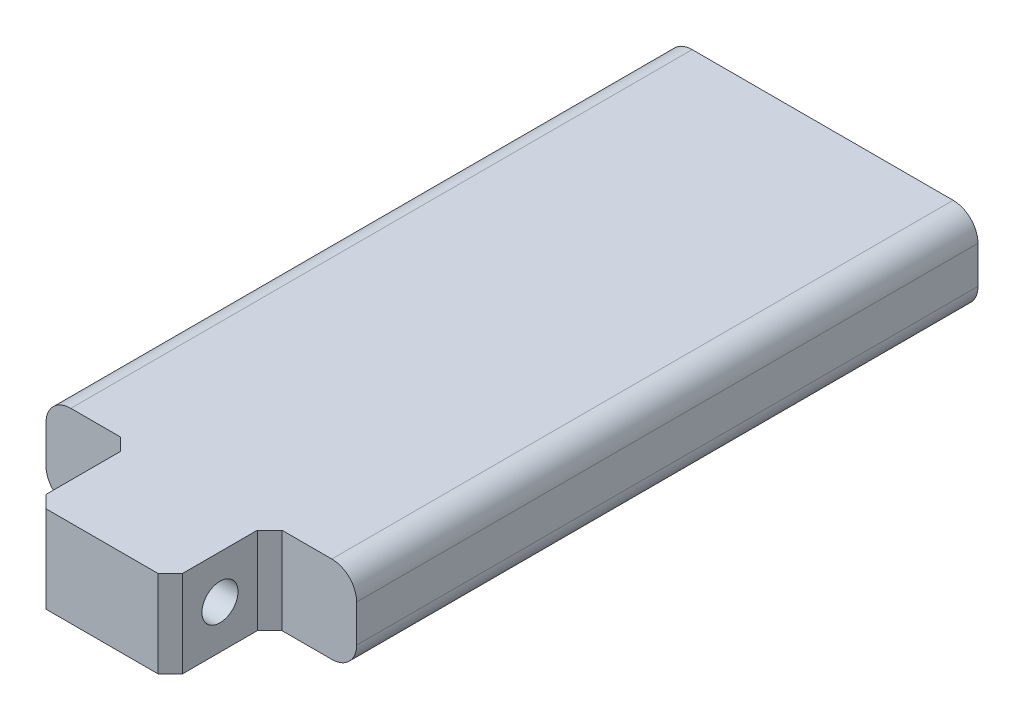
ISO-10303-21;
HEADER;
FILE_DESCRIPTION(('STEP AP214'),'2;1');
FILE_NAME('part.step','',(''),(''),'','','');
FILE_SCHEMA(('AUTOMOTIVE_DESIGN { 1 0 10303 214 1 1 1 1 }'));
ENDSEC;
DATA;
#1=APPLICATION_CONTEXT('core data for automotive mechanical design processes');
#2=APPLICATION_PROTOCOL_DEFINITION('international standard','automotive_design',2000,#1);
#3=PRODUCT_CONTEXT('',#1,'mechanical');
#4=PRODUCT('Part','Part','',(#3));
#5=PRODUCT_RELATED_PRODUCT_CATEGORY('part','',(#4));
#6=PRODUCT_DEFINITION_FORMATION('','',#4);
#7=PRODUCT_DEFINITION_CONTEXT('part definition',#1,'design');
#8=PRODUCT_DEFINITION('design','',#6,#7);
#9=PRODUCT_DEFINITION_SHAPE('','',#8);
#10=(LENGTH_UNIT() NAMED_UNIT(*) SI_UNIT(.MILLI.,.METRE.));
#11=(NAMED_UNIT(*) PLANE_ANGLE_UNIT() SI_UNIT($,.RADIAN.));
#12=(NAMED_UNIT(*) SI_UNIT($,.STERADIAN.) SOLID_ANGLE_UNIT());
#13=UNCERTAINTY_MEASURE_WITH_UNIT(LENGTH_MEASURE(1.E-05),#10,'distance_accuracy_value','');
#14=(GEOMETRIC_REPRESENTATION_CONTEXT(3) GLOBAL_UNCERTAINTY_ASSIGNED_CONTEXT((#13)) GLOBAL_UNIT_ASSIGNED_CONTEXT((#10,
#11,#12)) REPRESENTATION_CONTEXT('',''));
#15=CARTESIAN_POINT('',(0.,0.,0.));
#16=DIRECTION('',(0.,0.,1.));
#17=DIRECTION('',(1.,0.,0.));
#18=AXIS2_PLACEMENT_3D('',#15,#16,#17);
#19=CARTESIAN_POINT('',(12.5,-3.5,58.));
#20=DIRECTION('',(-1.,0.,0.));
#21=DIRECTION('',(0.,0.,1.));
#22=AXIS2_PLACEMENT_3D('',#19,#20,#21);
#23=PLANE('',#22);
#24=DIRECTION('',(0.,1.,0.));
#25=VECTOR('',#24,1.);
#26=CARTESIAN_POINT('',(12.5,-3.5,0.));
#27=LINE('',#26,#25);
#28=CARTESIAN_POINT('',(12.5,-1.5,0.));
#29=VERTEX_POINT('',#28);
#30=CARTESIAN_POINT('',(12.5,1.5,0.));
#31=VERTEX_POINT('',#30);
#32=EDGE_CURVE('E201',#29,#31,#27,.T.);
#33=ORIENTED_EDGE('',*,*,#32,.T.);
#34=DIRECTION('',(0.,0.,-1.));
#35=VECTOR('',#34,1.);
#36=CARTESIAN_POINT('',(12.5,1.5,58.));
#37=LINE('',#36,#35);
#38=CARTESIAN_POINT('',(12.5,1.5,50.));
#39=VERTEX_POINT('',#38);
#40=EDGE_CURVE('E256',#31,#39,#37,.F.);
#41=ORIENTED_EDGE('',*,*,#40,.T.);
#42=DIRECTION('',(0.,1.,0.));
#43=VECTOR('',#42,1.);
#44=CARTESIAN_POINT('',(12.5,-3.5,50.));
#45=LINE('',#44,#43);
#46=CARTESIAN_POINT('',(12.5,-1.5,50.));
#47=VERTEX_POINT('',#46);
#48=EDGE_CURVE('E184',#47,#39,#45,.T.);
#49=ORIENTED_EDGE('',*,*,#48,.F.);
#50=DIRECTION('',(0.,0.,-1.));
#51=VECTOR('',#50,1.);
#52=CARTESIAN_POINT('',(12.5,-1.5,58.));
#53=LINE('',#52,#51);
#54=EDGE_CURVE('E253',#47,#29,#53,.T.);
#55=ORIENTED_EDGE('',*,*,#54,.T.);
#56=EDGE_LOOP('',(#33,#41,#49,#55));
#57=FACE_BOUND('',#56,.T.);
#58=ADVANCED_FACE('F37',(#57),#23,.F.);
#59=CARTESIAN_POINT('',(-12.5,3.5,58.));
#60=DIRECTION('',(0.,-1.,0.));
#61=DIRECTION('',(0.,0.,-1.));
#62=AXIS2_PLACEMENT_3D('',#59,#60,#61);
#63=PLANE('',#62);
#64=DIRECTION('',(-1.,0.,0.));
#65=VECTOR('',#64,1.);
#66=CARTESIAN_POINT('',(12.5,3.5,50.));
#67=LINE('',#66,#65);
#68=CARTESIAN_POINT('',(10.5,3.5,50.));
#69=VERTEX_POINT('',#68);
#70=CARTESIAN_POINT('',(6.5,3.5,50.));
#71=VERTEX_POINT('',#70);
#72=EDGE_CURVE('E177',#69,#71,#67,.T.);
#73=ORIENTED_EDGE('',*,*,#72,.F.);
#74=DIRECTION('',(0.,0.,-1.));
#75=VECTOR('',#74,1.);
#76=CARTESIAN_POINT('',(10.5,3.5,58.));
#77=LINE('',#76,#75);
#78=CARTESIAN_POINT('',(10.5,3.5,0.));
#79=VERTEX_POINT('',#78);
#80=EDGE_CURVE('E242',#69,#79,#77,.T.);
#81=ORIENTED_EDGE('',*,*,#80,.T.);
#82=DIRECTION('',(-1.,0.,0.));
#83=VECTOR('',#82,1.);
#84=CARTESIAN_POINT('',(-12.5,3.5,0.));
#85=LINE('',#84,#83);
#86=CARTESIAN_POINT('',(-10.5,3.5,0.));
#87=VERTEX_POINT('',#86);
#88=EDGE_CURVE('E212',#79,#87,#85,.T.);
#89=ORIENTED_EDGE('',*,*,#88,.T.);
#90=DIRECTION('',(0.,0.,-1.));
#91=VECTOR('',#90,1.);
#92=CARTESIAN_POINT('',(-10.5,3.5,58.));
#93=LINE('',#92,#91);
#94=CARTESIAN_POINT('',(-10.5,3.5,50.));
#95=VERTEX_POINT('',#94);
#96=EDGE_CURVE('E239',#87,#95,#93,.F.);
#97=ORIENTED_EDGE('',*,*,#96,.T.);
#98=DIRECTION('',(-1.,0.,0.));
#99=VECTOR('',#98,1.);
#100=CARTESIAN_POINT('',(-12.5,3.5,50.));
#101=LINE('',#100,#99);
#102=CARTESIAN_POINT('',(-6.50000000000001,3.5,50.));
#103=VERTEX_POINT('',#102);
#104=EDGE_CURVE('E194',#103,#95,#101,.T.);
#105=ORIENTED_EDGE('',*,*,#104,.F.);
#106=DIRECTION('',(-0.707106781186547,0.,-0.707106781186547));
#107=VECTOR('',#106,1.);
#108=CARTESIAN_POINT('',(-5.5,3.5,51.));
#109=LINE('',#108,#107);
#110=CARTESIAN_POINT('',(-5.5,3.5,51.));
#111=VERTEX_POINT('',#110);
#112=EDGE_CURVE('E45',#103,#111,#109,.F.);
#113=ORIENTED_EDGE('',*,*,#112,.T.);
#114=DIRECTION('',(0.,0.,-1.));
#115=VECTOR('',#114,1.);
#116=CARTESIAN_POINT('',(-5.5,3.5,58.));
#117=LINE('',#116,#115);
#118=CARTESIAN_POINT('',(-5.5,3.5,57.));
#119=VERTEX_POINT('',#118);
#120=EDGE_CURVE('E190',#119,#111,#117,.T.);
#121=ORIENTED_EDGE('',*,*,#120,.F.);
#122=DIRECTION('',(-0.707106781186553,0.,-0.707106781186543));
#123=VECTOR('',#122,1.);
#124=CARTESIAN_POINT('',(-5.5,3.5,57.));
#125=LINE('',#124,#123);
#126=CARTESIAN_POINT('',(-4.49999999999999,3.5,58.));
#127=VERTEX_POINT('',#126);
#128=EDGE_CURVE('E224',#119,#127,#125,.F.);
#129=ORIENTED_EDGE('',*,*,#128,.T.);
#130=DIRECTION('',(-1.,0.,0.));
#131=VECTOR('',#130,1.);
#132=CARTESIAN_POINT('',(-12.5,3.5,58.));
#133=LINE('',#132,#131);
#134=CARTESIAN_POINT('',(4.50000000000001,3.5,58.));
#135=VERTEX_POINT('',#134);
#136=EDGE_CURVE('E202',#135,#127,#133,.T.);
#137=ORIENTED_EDGE('',*,*,#136,.F.);
#138=DIRECTION('',(-0.707106781186545,0.,0.70710678118655));
#139=VECTOR('',#138,1.);
#140=CARTESIAN_POINT('',(4.50000000000001,3.5,58.));
#141=LINE('',#140,#139);
#142=CARTESIAN_POINT('',(5.5,3.5,57.));
#143=VERTEX_POINT('',#142);
#144=EDGE_CURVE('E226',#135,#143,#141,.F.);
#145=ORIENTED_EDGE('',*,*,#144,.T.);
#146=DIRECTION('',(0.,0.,1.));
#147=VECTOR('',#146,1.);
#148=CARTESIAN_POINT('',(5.5,3.5,58.));
#149=LINE('',#148,#147);
#150=CARTESIAN_POINT('',(5.5,3.5,51.));
#151=VERTEX_POINT('',#150);
#152=EDGE_CURVE('E182',#151,#143,#149,.T.);
#153=ORIENTED_EDGE('',*,*,#152,.F.);
#154=DIRECTION('',(-0.707106781186543,0.,0.707106781186553));
#155=VECTOR('',#154,1.);
#156=CARTESIAN_POINT('',(-6.99999999999986,3.5,63.5000000000001));
#157=LINE('',#156,#155);
#158=EDGE_CURVE('E286',#151,#71,#157,.F.);
#159=ORIENTED_EDGE('',*,*,#158,.T.);
#160=EDGE_LOOP('',(#73,#81,#89,#97,#105,#113,#121,#129,#137,#145,#153,#159));
#161=FACE_BOUND('',#160,.T.);
#162=ADVANCED_FACE('F304',(#161),#63,.F.);
#163=CARTESIAN_POINT('',(-12.5,-3.5,58.));
#164=DIRECTION('',(1.,0.,0.));
#165=DIRECTION('',(0.,0.,-1.));
#166=AXIS2_PLACEMENT_3D('',#163,#164,#165);
#167=PLANE('',#166);
#168=DIRECTION('',(0.,1.,0.));
#169=VECTOR('',#168,1.);
#170=CARTESIAN_POINT('',(-12.5,-3.5,50.));
#171=LINE('',#170,#169);
#172=CARTESIAN_POINT('',(-12.5,-1.5,50.));
#173=VERTEX_POINT('',#172);
#174=CARTESIAN_POINT('',(-12.5,1.5,50.));
#175=VERTEX_POINT('',#174);
#176=EDGE_CURVE('E196',#173,#175,#171,.T.);
#177=ORIENTED_EDGE('',*,*,#176,.T.);
#178=DIRECTION('',(0.,0.,-1.));
#179=VECTOR('',#178,1.);
#180=CARTESIAN_POINT('',(-12.5,1.5,58.));
#181=LINE('',#180,#179);
#182=CARTESIAN_POINT('',(-12.5,1.5,0.));
#183=VERTEX_POINT('',#182);
#184=EDGE_CURVE('E269',#175,#183,#181,.T.);
#185=ORIENTED_EDGE('',*,*,#184,.T.);
#186=DIRECTION('',(0.,-1.,0.));
#187=VECTOR('',#186,1.);
#188=CARTESIAN_POINT('',(-12.5,-3.5,0.));
#189=LINE('',#188,#187);
#190=CARTESIAN_POINT('',(-12.5,-1.5,0.));
#191=VERTEX_POINT('',#190);
#192=EDGE_CURVE('E215',#183,#191,#189,.T.);
#193=ORIENTED_EDGE('',*,*,#192,.T.);
#194=DIRECTION('',(0.,0.,-1.));
#195=VECTOR('',#194,1.);
#196=CARTESIAN_POINT('',(-12.5,-1.5,58.));
#197=LINE('',#196,#195);
#198=EDGE_CURVE('E267',#191,#173,#197,.F.);
#199=ORIENTED_EDGE('',*,*,#198,.T.);
#200=EDGE_LOOP('',(#177,#185,#193,#199));
#201=FACE_BOUND('',#200,.T.);
#202=ADVANCED_FACE('F324',(#201),#167,.F.);
#203=CARTESIAN_POINT('',(-12.5,-3.5,58.));
#204=DIRECTION('',(0.,1.,0.));
#205=DIRECTION('',(0.,0.,1.));
#206=AXIS2_PLACEMENT_3D('',#203,#204,#205);
#207=PLANE('',#206);
#208=DIRECTION('',(1.,0.,0.));
#209=VECTOR('',#208,1.);
#210=CARTESIAN_POINT('',(-12.5,-3.5,0.));
#211=LINE('',#210,#209);
#212=CARTESIAN_POINT('',(-10.5,-3.5,0.));
#213=VERTEX_POINT('',#212);
#214=CARTESIAN_POINT('',(10.5,-3.5,0.));
#215=VERTEX_POINT('',#214);
#216=EDGE_CURVE('E206',#213,#215,#211,.T.);
#217=ORIENTED_EDGE('',*,*,#216,.T.);
#218=DIRECTION('',(0.,0.,-1.));
#219=VECTOR('',#218,1.);
#220=CARTESIAN_POINT('',(10.5,-3.5,58.));
#221=LINE('',#220,#219);
#222=CARTESIAN_POINT('',(10.5,-3.5,50.));
#223=VERTEX_POINT('',#222);
#224=EDGE_CURVE('E265',#215,#223,#221,.F.);
#225=ORIENTED_EDGE('',*,*,#224,.T.);
#226=DIRECTION('',(-1.,0.,0.));
#227=VECTOR('',#226,1.);
#228=CARTESIAN_POINT('',(12.5,-3.5,50.));
#229=LINE('',#228,#227);
#230=CARTESIAN_POINT('',(6.5,-3.5,50.));
#231=VERTEX_POINT('',#230);
#232=EDGE_CURVE('E178',#223,#231,#229,.T.);
#233=ORIENTED_EDGE('',*,*,#232,.T.);
#234=DIRECTION('',(0.707106781186543,0.,-0.707106781186553));
#235=VECTOR('',#234,1.);
#236=CARTESIAN_POINT('',(-6.99999999999986,-3.5,63.5000000000001));
#237=LINE('',#236,#235);
#238=CARTESIAN_POINT('',(5.5,-3.5,51.));
#239=VERTEX_POINT('',#238);
#240=EDGE_CURVE('E288',#231,#239,#237,.F.);
#241=ORIENTED_EDGE('',*,*,#240,.T.);
#242=DIRECTION('',(0.,0.,1.));
#243=VECTOR('',#242,1.);
#244=CARTESIAN_POINT('',(5.5,-3.5,58.));
#245=LINE('',#244,#243);
#246=CARTESIAN_POINT('',(5.5,-3.5,57.));
#247=VERTEX_POINT('',#246);
#248=EDGE_CURVE('E181',#239,#247,#245,.T.);
#249=ORIENTED_EDGE('',*,*,#248,.T.);
#250=DIRECTION('',(0.707106781186545,0.,-0.70710678118655));
#251=VECTOR('',#250,1.);
#252=CARTESIAN_POINT('',(4.50000000000001,-3.5,58.));
#253=LINE('',#252,#251);
#254=CARTESIAN_POINT('',(4.50000000000001,-3.5,58.));
#255=VERTEX_POINT('',#254);
#256=EDGE_CURVE('E234',#247,#255,#253,.F.);
#257=ORIENTED_EDGE('',*,*,#256,.T.);
#258=DIRECTION('',(1.,0.,0.));
#259=VECTOR('',#258,1.);
#260=CARTESIAN_POINT('',(-12.5,-3.5,58.));
#261=LINE('',#260,#259);
#262=CARTESIAN_POINT('',(-4.49999999999999,-3.5,58.));
#263=VERTEX_POINT('',#262);
#264=EDGE_CURVE('E205',#263,#255,#261,.T.);
#265=ORIENTED_EDGE('',*,*,#264,.F.);
#266=DIRECTION('',(0.707106781186553,0.,0.707106781186543));
#267=VECTOR('',#266,1.);
#268=CARTESIAN_POINT('',(-5.5,-3.5,57.));
#269=LINE('',#268,#267);
#270=CARTESIAN_POINT('',(-5.5,-3.5,57.));
#271=VERTEX_POINT('',#270);
#272=EDGE_CURVE('E232',#263,#271,#269,.F.);
#273=ORIENTED_EDGE('',*,*,#272,.T.);
#274=DIRECTION('',(0.,0.,-1.));
#275=VECTOR('',#274,1.);
#276=CARTESIAN_POINT('',(-5.5,-3.5,58.));
#277=LINE('',#276,#275);
#278=CARTESIAN_POINT('',(-5.5,-3.5,51.));
#279=VERTEX_POINT('',#278);
#280=EDGE_CURVE('E191',#271,#279,#277,.T.);
#281=ORIENTED_EDGE('',*,*,#280,.T.);
#282=DIRECTION('',(0.707106781186547,0.,0.707106781186547));
#283=VECTOR('',#282,1.);
#284=CARTESIAN_POINT('',(-5.5,-3.5,51.));
#285=LINE('',#284,#283);
#286=CARTESIAN_POINT('',(-6.50000000000001,-3.5,50.));
#287=VERTEX_POINT('',#286);
#288=EDGE_CURVE('E11',#279,#287,#285,.F.);
#289=ORIENTED_EDGE('',*,*,#288,.T.);
#290=DIRECTION('',(-1.,0.,0.));
#291=VECTOR('',#290,1.);
#292=CARTESIAN_POINT('',(-12.5,-3.5,50.));
#293=LINE('',#292,#291);
#294=CARTESIAN_POINT('',(-10.5,-3.5,50.));
#295=VERTEX_POINT('',#294);
#296=EDGE_CURVE('E193',#287,#295,#293,.T.);
#297=ORIENTED_EDGE('',*,*,#296,.T.);
#298=DIRECTION('',(0.,0.,-1.));
#299=VECTOR('',#298,1.);
#300=CARTESIAN_POINT('',(-10.5,-3.5,58.));
#301=LINE('',#300,#299);
#302=EDGE_CURVE('E262',#295,#213,#301,.T.);
#303=ORIENTED_EDGE('',*,*,#302,.T.);
#304=EDGE_LOOP('',(#217,#225,#233,#241,#249,#257,#265,#273,#281,#289,#297,#303));
#305=FACE_BOUND('',#304,.T.);
#306=ADVANCED_FACE('F292',(#305),#207,.F.);
#307=CARTESIAN_POINT('',(0.,0.,58.));
#308=DIRECTION('',(0.,0.,-1.));
#309=DIRECTION('',(-1.,0.,0.));
#310=AXIS2_PLACEMENT_3D('',#307,#308,#309);
#311=PLANE('',#310);
#312=ORIENTED_EDGE('',*,*,#264,.T.);
#313=DIRECTION('',(0.,1.,0.));
#314=VECTOR('',#313,1.);
#315=CARTESIAN_POINT('',(4.50000000000001,0.,58.));
#316=LINE('',#315,#314);
#317=EDGE_CURVE('E221',#255,#135,#316,.T.);
#318=ORIENTED_EDGE('',*,*,#317,.T.);
#319=ORIENTED_EDGE('',*,*,#136,.T.);
#320=DIRECTION('',(0.,-1.,0.));
#321=VECTOR('',#320,1.);
#322=CARTESIAN_POINT('',(-4.49999999999999,0.,58.));
#323=LINE('',#322,#321);
#324=EDGE_CURVE('E209',#127,#263,#323,.T.);
#325=ORIENTED_EDGE('',*,*,#324,.T.);
#326=EDGE_LOOP('',(#312,#318,#319,#325));
#327=FACE_BOUND('',#326,.T.);
#328=ADVANCED_FACE('F382',(#327),#311,.F.);
#329=CARTESIAN_POINT('',(0.,0.,0.));
#330=DIRECTION('',(0.,0.,-1.));
#331=DIRECTION('',(-1.,0.,0.));
#332=AXIS2_PLACEMENT_3D('',#329,#330,#331);
#333=PLANE('',#332);
#334=CARTESIAN_POINT('',(7.,0.,0.));
#335=DIRECTION('',(0.,0.,-1.));
#336=DIRECTION('',(-1.,0.,0.));
#337=AXIS2_PLACEMENT_3D('',#334,#335,#336);
#338=CIRCLE('',#337,1.24999999999999);
#339=CARTESIAN_POINT('',(5.75000000000001,0.,0.));
#340=VERTEX_POINT('',#339);
#341=EDGE_CURVE('E165',#340,#340,#338,.T.);
#342=ORIENTED_EDGE('',*,*,#341,.F.);
#343=EDGE_LOOP('',(#342));
#344=FACE_BOUND('',#343,.T.);
#345=CARTESIAN_POINT('',(-7.,0.,0.));
#346=DIRECTION('',(0.,0.,-1.));
#347=DIRECTION('',(-1.,0.,0.));
#348=AXIS2_PLACEMENT_3D('',#345,#346,#347);
#349=CIRCLE('',#348,1.24999999999999);
#350=CARTESIAN_POINT('',(-8.24999999999999,0.,0.));
#351=VERTEX_POINT('',#350);
#352=EDGE_CURVE('E164',#351,#351,#349,.T.);
#353=ORIENTED_EDGE('',*,*,#352,.F.);
#354=EDGE_LOOP('',(#353));
#355=FACE_BOUND('',#354,.T.);
#356=ORIENTED_EDGE('',*,*,#88,.F.);
#357=CARTESIAN_POINT('',(10.5,1.5,0.));
#358=DIRECTION('',(0.,0.,-1.));
#359=DIRECTION('',(-1.,0.,0.));
#360=AXIS2_PLACEMENT_3D('',#357,#358,#359);
#361=CIRCLE('',#360,2.);
#362=EDGE_CURVE('E251',#79,#31,#361,.T.);
#363=ORIENTED_EDGE('',*,*,#362,.T.);
#364=ORIENTED_EDGE('',*,*,#32,.F.);
#365=CARTESIAN_POINT('',(10.5,-1.5,0.));
#366=DIRECTION('',(0.,0.,-1.));
#367=DIRECTION('',(-1.,0.,0.));
#368=AXIS2_PLACEMENT_3D('',#365,#366,#367);
#369=CIRCLE('',#368,2.);
#370=EDGE_CURVE('E249',#29,#215,#369,.T.);
#371=ORIENTED_EDGE('',*,*,#370,.T.);
#372=ORIENTED_EDGE('',*,*,#216,.F.);
#373=CARTESIAN_POINT('',(-10.5,-1.5,0.));
#374=DIRECTION('',(0.,0.,-1.));
#375=DIRECTION('',(-1.,0.,0.));
#376=AXIS2_PLACEMENT_3D('',#373,#374,#375);
#377=CIRCLE('',#376,2.);
#378=EDGE_CURVE('E245',#213,#191,#377,.T.);
#379=ORIENTED_EDGE('',*,*,#378,.T.);
#380=ORIENTED_EDGE('',*,*,#192,.F.);
#381=CARTESIAN_POINT('',(-10.5,1.5,0.));
#382=DIRECTION('',(0.,0.,-1.));
#383=DIRECTION('',(-1.,0.,0.));
#384=AXIS2_PLACEMENT_3D('',#381,#382,#383);
#385=CIRCLE('',#384,2.);
#386=EDGE_CURVE('E247',#183,#87,#385,.T.);
#387=ORIENTED_EDGE('',*,*,#386,.T.);
#388=EDGE_LOOP('',(#356,#363,#364,#371,#372,#379,#380,#387));
#389=FACE_BOUND('',#388,.T.);
#390=ADVANCED_FACE('F316',(#344,#355,#389),#333,.T.);
#391=CARTESIAN_POINT('',(-12.5,-3.5,50.));
#392=DIRECTION('',(0.,0.,-1.));
#393=DIRECTION('',(-1.,0.,0.));
#394=AXIS2_PLACEMENT_3D('',#391,#392,#393);
#395=PLANE('',#394);
#396=ORIENTED_EDGE('',*,*,#296,.F.);
#397=DIRECTION('',(0.,1.,0.));
#398=VECTOR('',#397,1.);
#399=CARTESIAN_POINT('',(-6.50000000000001,3.5,50.));
#400=LINE('',#399,#398);
#401=EDGE_CURVE('E282',#287,#103,#400,.T.);
#402=ORIENTED_EDGE('',*,*,#401,.T.);
#403=ORIENTED_EDGE('',*,*,#104,.T.);
#404=CARTESIAN_POINT('',(-10.5,1.5,50.));
#405=DIRECTION('',(0.,0.,-1.));
#406=DIRECTION('',(-1.,0.,0.));
#407=AXIS2_PLACEMENT_3D('',#404,#405,#406);
#408=CIRCLE('',#407,2.);
#409=EDGE_CURVE('E275',#95,#175,#408,.F.);
#410=ORIENTED_EDGE('',*,*,#409,.T.);
#411=ORIENTED_EDGE('',*,*,#176,.F.);
#412=CARTESIAN_POINT('',(-10.5,-1.5,50.));
#413=DIRECTION('',(0.,0.,-1.));
#414=DIRECTION('',(-1.,0.,0.));
#415=AXIS2_PLACEMENT_3D('',#412,#413,#414);
#416=CIRCLE('',#415,2.);
#417=EDGE_CURVE('E272',#173,#295,#416,.F.);
#418=ORIENTED_EDGE('',*,*,#417,.T.);
#419=EDGE_LOOP('',(#396,#402,#403,#410,#411,#418));
#420=FACE_BOUND('',#419,.T.);
#421=ADVANCED_FACE('F330',(#420),#395,.F.);
#422=CARTESIAN_POINT('',(-5.5,-3.5,58.));
#423=DIRECTION('',(1.,0.,0.));
#424=DIRECTION('',(0.,0.,-1.));
#425=AXIS2_PLACEMENT_3D('',#422,#423,#424);
#426=PLANE('',#425);
#427=CARTESIAN_POINT('',(-5.50000000000037,0.,53.9999999999999));
#428=DIRECTION('',(-1.,0.,0.));
#429=DIRECTION('',(0.,0.,1.));
#430=AXIS2_PLACEMENT_3D('',#427,#428,#429);
#431=CIRCLE('',#430,1.45);
#432=CARTESIAN_POINT('',(-5.50000000000037,0.,55.4499999999999));
#433=VERTEX_POINT('',#432);
#434=EDGE_CURVE('E563',#433,#433,#431,.T.);
#435=ORIENTED_EDGE('',*,*,#434,.F.);
#436=EDGE_LOOP('',(#435));
#437=FACE_BOUND('',#436,.T.);
#438=ORIENTED_EDGE('',*,*,#120,.T.);
#439=DIRECTION('',(0.,-1.,0.));
#440=VECTOR('',#439,1.);
#441=CARTESIAN_POINT('',(-5.5,-3.5,51.));
#442=LINE('',#441,#440);
#443=EDGE_CURVE('E58',#111,#279,#442,.T.);
#444=ORIENTED_EDGE('',*,*,#443,.T.);
#445=ORIENTED_EDGE('',*,*,#280,.F.);
#446=DIRECTION('',(0.,1.,0.));
#447=VECTOR('',#446,1.);
#448=CARTESIAN_POINT('',(-5.5,-3.5,57.));
#449=LINE('',#448,#447);
#450=EDGE_CURVE('E236',#271,#119,#449,.T.);
#451=ORIENTED_EDGE('',*,*,#450,.T.);
#452=EDGE_LOOP('',(#438,#444,#445,#451));
#453=FACE_BOUND('',#452,.T.);
#454=ADVANCED_FACE('F378',(#437,#453),#426,.F.);
#455=CARTESIAN_POINT('',(5.5,-3.5,58.));
#456=DIRECTION('',(-1.,0.,0.));
#457=DIRECTION('',(0.,0.,1.));
#458=AXIS2_PLACEMENT_3D('',#455,#456,#457);
#459=PLANE('',#458);
#460=CARTESIAN_POINT('',(5.5,0.,53.9999999999999));
#461=DIRECTION('',(-1.,0.,0.));
#462=DIRECTION('',(0.,0.,1.));
#463=AXIS2_PLACEMENT_3D('',#460,#461,#462);
#464=CIRCLE('',#463,1.45);
#465=CARTESIAN_POINT('',(5.5,0.,55.4499999999999));
#466=VERTEX_POINT('',#465);
#467=EDGE_CURVE('E171',#466,#466,#464,.T.);
#468=ORIENTED_EDGE('',*,*,#467,.T.);
#469=EDGE_LOOP('',(#468));
#470=FACE_BOUND('',#469,.T.);
#471=ORIENTED_EDGE('',*,*,#248,.F.);
#472=DIRECTION('',(0.,1.,0.));
#473=VECTOR('',#472,1.);
#474=CARTESIAN_POINT('',(5.5,3.5,51.));
#475=LINE('',#474,#473);
#476=EDGE_CURVE('E277',#239,#151,#475,.T.);
#477=ORIENTED_EDGE('',*,*,#476,.T.);
#478=ORIENTED_EDGE('',*,*,#152,.T.);
#479=DIRECTION('',(0.,-1.,0.));
#480=VECTOR('',#479,1.);
#481=CARTESIAN_POINT('',(5.5,-3.5,57.));
#482=LINE('',#481,#480);
#483=EDGE_CURVE('E229',#143,#247,#482,.T.);
#484=ORIENTED_EDGE('',*,*,#483,.T.);
#485=EDGE_LOOP('',(#471,#477,#478,#484));
#486=FACE_BOUND('',#485,.T.);
#487=ADVANCED_FACE('F298',(#470,#486),#459,.F.);
#488=CARTESIAN_POINT('',(12.5,-3.5,50.));
#489=DIRECTION('',(0.,0.,-1.));
#490=DIRECTION('',(-1.,0.,0.));
#491=AXIS2_PLACEMENT_3D('',#488,#489,#490);
#492=PLANE('',#491);
#493=ORIENTED_EDGE('',*,*,#72,.T.);
#494=DIRECTION('',(0.,-1.,0.));
#495=VECTOR('',#494,1.);
#496=CARTESIAN_POINT('',(6.5,-3.5,50.));
#497=LINE('',#496,#495);
#498=EDGE_CURVE('E280',#71,#231,#497,.T.);
#499=ORIENTED_EDGE('',*,*,#498,.T.);
#500=ORIENTED_EDGE('',*,*,#232,.F.);
#501=CARTESIAN_POINT('',(10.5,-1.5,50.));
#502=DIRECTION('',(0.,0.,-1.));
#503=DIRECTION('',(-1.,0.,0.));
#504=AXIS2_PLACEMENT_3D('',#501,#502,#503);
#505=CIRCLE('',#504,2.);
#506=EDGE_CURVE('E258',#223,#47,#505,.F.);
#507=ORIENTED_EDGE('',*,*,#506,.T.);
#508=ORIENTED_EDGE('',*,*,#48,.T.);
#509=CARTESIAN_POINT('',(10.5,1.5,50.));
#510=DIRECTION('',(0.,0.,-1.));
#511=DIRECTION('',(-1.,0.,0.));
#512=AXIS2_PLACEMENT_3D('',#509,#510,#511);
#513=CIRCLE('',#512,2.);
#514=EDGE_CURVE('E260',#39,#69,#513,.F.);
#515=ORIENTED_EDGE('',*,*,#514,.T.);
#516=EDGE_LOOP('',(#493,#499,#500,#507,#508,#515));
#517=FACE_BOUND('',#516,.T.);
#518=ADVANCED_FACE('F307',(#517),#492,.F.);
#519=CARTESIAN_POINT('',(-7.,0.,7.5));
#520=DIRECTION('',(0.,0.,-1.));
#521=DIRECTION('',(-1.,0.,0.));
#522=AXIS2_PLACEMENT_3D('',#519,#520,#521);
#523=CONICAL_SURFACE('',#522,1.25,1.02974425867665);
#524=CARTESIAN_POINT('',(-7.,0.,8.25107577378445));
#525=VERTEX_POINT('',#524);
#526=VERTEX_LOOP('',#525);
#527=FACE_BOUND('',#526,.T.);
#528=CARTESIAN_POINT('',(-7.,0.,7.5));
#529=DIRECTION('',(0.,0.,-1.));
#530=DIRECTION('',(-1.,0.,0.));
#531=AXIS2_PLACEMENT_3D('',#528,#529,#530);
#532=CIRCLE('',#531,1.25);
#533=CARTESIAN_POINT('',(-8.25,0.,7.5));
#534=VERTEX_POINT('',#533);
#535=EDGE_CURVE('E168',#534,#534,#532,.T.);
#536=ORIENTED_EDGE('',*,*,#535,.T.);
#537=EDGE_LOOP('',(#536));
#538=FACE_BOUND('',#537,.T.);
#539=ADVANCED_FACE('F433',(#527,#538),#523,.F.);
#540=CARTESIAN_POINT('',(-7.,0.,0.));
#541=DIRECTION('',(0.,0.,-1.));
#542=DIRECTION('',(-1.,0.,0.));
#543=AXIS2_PLACEMENT_3D('',#540,#541,#542);
#544=CYLINDRICAL_SURFACE('',#543,1.24999999999999);
#545=ORIENTED_EDGE('',*,*,#535,.F.);
#546=EDGE_LOOP('',(#545));
#547=FACE_BOUND('',#546,.T.);
#548=ORIENTED_EDGE('',*,*,#352,.T.);
#549=EDGE_LOOP('',(#548));
#550=FACE_BOUND('',#549,.T.);
#551=ADVANCED_FACE('F158',(#547,#550),#544,.F.);
#552=CARTESIAN_POINT('',(7.,0.,7.5));
#553=DIRECTION('',(0.,0.,-1.));
#554=DIRECTION('',(-1.,0.,0.));
#555=AXIS2_PLACEMENT_3D('',#552,#553,#554);
#556=CONICAL_SURFACE('',#555,1.25,1.02974425867665);
#557=CARTESIAN_POINT('',(7.,0.,8.25107577378445));
#558=VERTEX_POINT('',#557);
#559=VERTEX_LOOP('',#558);
#560=FACE_BOUND('',#559,.T.);
#561=CARTESIAN_POINT('',(7.,0.,7.5));
#562=DIRECTION('',(0.,0.,-1.));
#563=DIRECTION('',(-1.,0.,0.));
#564=AXIS2_PLACEMENT_3D('',#561,#562,#563);
#565=CIRCLE('',#564,1.25);
#566=CARTESIAN_POINT('',(5.75,0.,7.5));
#567=VERTEX_POINT('',#566);
#568=EDGE_CURVE('E162',#567,#567,#565,.T.);
#569=ORIENTED_EDGE('',*,*,#568,.T.);
#570=EDGE_LOOP('',(#569));
#571=FACE_BOUND('',#570,.T.);
#572=ADVANCED_FACE('F154',(#560,#571),#556,.F.);
#573=CARTESIAN_POINT('',(7.,0.,0.));
#574=DIRECTION('',(0.,0.,-1.));
#575=DIRECTION('',(-1.,0.,0.));
#576=AXIS2_PLACEMENT_3D('',#573,#574,#575);
#577=CYLINDRICAL_SURFACE('',#576,1.24999999999999);
#578=ORIENTED_EDGE('',*,*,#568,.F.);
#579=EDGE_LOOP('',(#578));
#580=FACE_BOUND('',#579,.T.);
#581=ORIENTED_EDGE('',*,*,#341,.T.);
#582=EDGE_LOOP('',(#581));
#583=FACE_BOUND('',#582,.T.);
#584=ADVANCED_FACE('F157',(#580,#583),#577,.F.);
#585=CARTESIAN_POINT('',(4.50000000000001,0.,58.));
#586=DIRECTION('',(-0.70710678118655,0.,-0.707106781186545));
#587=DIRECTION('',(0.,1.,0.));
#588=AXIS2_PLACEMENT_3D('',#585,#586,#587);
#589=PLANE('',#588);
#590=ORIENTED_EDGE('',*,*,#256,.F.);
#591=ORIENTED_EDGE('',*,*,#483,.F.);
#592=ORIENTED_EDGE('',*,*,#144,.F.);
#593=ORIENTED_EDGE('',*,*,#317,.F.);
#594=EDGE_LOOP('',(#590,#591,#592,#593));
#595=FACE_BOUND('',#594,.T.);
#596=ADVANCED_FACE('F350',(#595),#589,.F.);
#597=CARTESIAN_POINT('',(-5.5,-3.5,57.));
#598=DIRECTION('',(0.707106781186542,0.,-0.707106781186552));
#599=DIRECTION('',(0.,1.,0.));
#600=AXIS2_PLACEMENT_3D('',#597,#598,#599);
#601=PLANE('',#600);
#602=ORIENTED_EDGE('',*,*,#272,.F.);
#603=ORIENTED_EDGE('',*,*,#324,.F.);
#604=ORIENTED_EDGE('',*,*,#128,.F.);
#605=ORIENTED_EDGE('',*,*,#450,.F.);
#606=EDGE_LOOP('',(#602,#603,#604,#605));
#607=FACE_BOUND('',#606,.T.);
#608=ADVANCED_FACE('F353',(#607),#601,.F.);
#609=CARTESIAN_POINT('',(-5.50000000000037,0.,53.9999999999999));
#610=DIRECTION('',(-1.,0.,0.));
#611=DIRECTION('',(0.,0.,1.));
#612=AXIS2_PLACEMENT_3D('',#609,#610,#611);
#613=CYLINDRICAL_SURFACE('',#612,1.45);
#614=ORIENTED_EDGE('',*,*,#434,.T.);
#615=EDGE_LOOP('',(#614));
#616=FACE_BOUND('',#615,.T.);
#617=ORIENTED_EDGE('',*,*,#467,.F.);
#618=EDGE_LOOP('',(#617));
#619=FACE_BOUND('',#618,.T.);
#620=ADVANCED_FACE('F357',(#616,#619),#613,.F.);
#621=CARTESIAN_POINT('',(10.5,1.5,58.));
#622=DIRECTION('',(0.,0.,-1.));
#623=DIRECTION('',(-1.,0.,0.));
#624=AXIS2_PLACEMENT_3D('',#621,#622,#623);
#625=CYLINDRICAL_SURFACE('',#624,2.);
#626=ORIENTED_EDGE('',*,*,#514,.F.);
#627=ORIENTED_EDGE('',*,*,#40,.F.);
#628=ORIENTED_EDGE('',*,*,#362,.F.);
#629=ORIENTED_EDGE('',*,*,#80,.F.);
#630=EDGE_LOOP('',(#626,#627,#628,#629));
#631=FACE_BOUND('',#630,.T.);
#632=ADVANCED_FACE('F312',(#631),#625,.T.);
#633=CARTESIAN_POINT('',(10.5,-1.5,58.));
#634=DIRECTION('',(0.,0.,-1.));
#635=DIRECTION('',(-1.,0.,0.));
#636=AXIS2_PLACEMENT_3D('',#633,#634,#635);
#637=CYLINDRICAL_SURFACE('',#636,2.);
#638=ORIENTED_EDGE('',*,*,#506,.F.);
#639=ORIENTED_EDGE('',*,*,#224,.F.);
#640=ORIENTED_EDGE('',*,*,#370,.F.);
#641=ORIENTED_EDGE('',*,*,#54,.F.);
#642=EDGE_LOOP('',(#638,#639,#640,#641));
#643=FACE_BOUND('',#642,.T.);
#644=ADVANCED_FACE('F339',(#643),#637,.T.);
#645=CARTESIAN_POINT('',(-10.5,1.5,58.));
#646=DIRECTION('',(0.,0.,-1.));
#647=DIRECTION('',(-1.,0.,0.));
#648=AXIS2_PLACEMENT_3D('',#645,#646,#647);
#649=CYLINDRICAL_SURFACE('',#648,2.);
#650=ORIENTED_EDGE('',*,*,#409,.F.);
#651=ORIENTED_EDGE('',*,*,#96,.F.);
#652=ORIENTED_EDGE('',*,*,#386,.F.);
#653=ORIENTED_EDGE('',*,*,#184,.F.);
#654=EDGE_LOOP('',(#650,#651,#652,#653));
#655=FACE_BOUND('',#654,.T.);
#656=ADVANCED_FACE('F322',(#655),#649,.T.);
#657=CARTESIAN_POINT('',(-10.5,-1.5,58.));
#658=DIRECTION('',(0.,0.,-1.));
#659=DIRECTION('',(-1.,0.,0.));
#660=AXIS2_PLACEMENT_3D('',#657,#658,#659);
#661=CYLINDRICAL_SURFACE('',#660,2.);
#662=ORIENTED_EDGE('',*,*,#417,.F.);
#663=ORIENTED_EDGE('',*,*,#198,.F.);
#664=ORIENTED_EDGE('',*,*,#378,.F.);
#665=ORIENTED_EDGE('',*,*,#302,.F.);
#666=EDGE_LOOP('',(#662,#663,#664,#665));
#667=FACE_BOUND('',#666,.T.);
#668=ADVANCED_FACE('F333',(#667),#661,.T.);
#669=CARTESIAN_POINT('',(5.5,-3.5,51.));
#670=DIRECTION('',(0.707106781186552,0.,0.707106781186542));
#671=DIRECTION('',(0.,-1.,0.));
#672=AXIS2_PLACEMENT_3D('',#669,#670,#671);
#673=PLANE('',#672);
#674=ORIENTED_EDGE('',*,*,#240,.F.);
#675=ORIENTED_EDGE('',*,*,#498,.F.);
#676=ORIENTED_EDGE('',*,*,#158,.F.);
#677=ORIENTED_EDGE('',*,*,#476,.F.);
#678=EDGE_LOOP('',(#674,#675,#676,#677));
#679=FACE_BOUND('',#678,.T.);
#680=ADVANCED_FACE('F302',(#679),#673,.T.);
#681=CARTESIAN_POINT('',(-6.50000000000001,-3.5,50.));
#682=DIRECTION('',(-0.707106781186547,0.,0.707106781186547));
#683=DIRECTION('',(0.,-1.,0.));
#684=AXIS2_PLACEMENT_3D('',#681,#682,#683);
#685=PLANE('',#684);
#686=ORIENTED_EDGE('',*,*,#288,.F.);
#687=ORIENTED_EDGE('',*,*,#443,.F.);
#688=ORIENTED_EDGE('',*,*,#112,.F.);
#689=ORIENTED_EDGE('',*,*,#401,.F.);
#690=EDGE_LOOP('',(#686,#687,#688,#689));
#691=FACE_BOUND('',#690,.T.);
#692=ADVANCED_FACE('F39',(#691),#685,.T.);
#693=CLOSED_SHELL('',(#58,#162,#202,#306,#328,#390,#421,#454,#487,#518,#539,#551,#572,#584,#596,
#608,#620,#632,#644,#656,#668,#680,#692));
#694=MANIFOLD_SOLID_BREP('B2',#693);
#695=ADVANCED_BREP_SHAPE_REPRESENTATION('',(#18,#694),#14);
#696=SHAPE_DEFINITION_REPRESENTATION(#9,#695);
ENDSEC;
END-ISO-10303-21;
